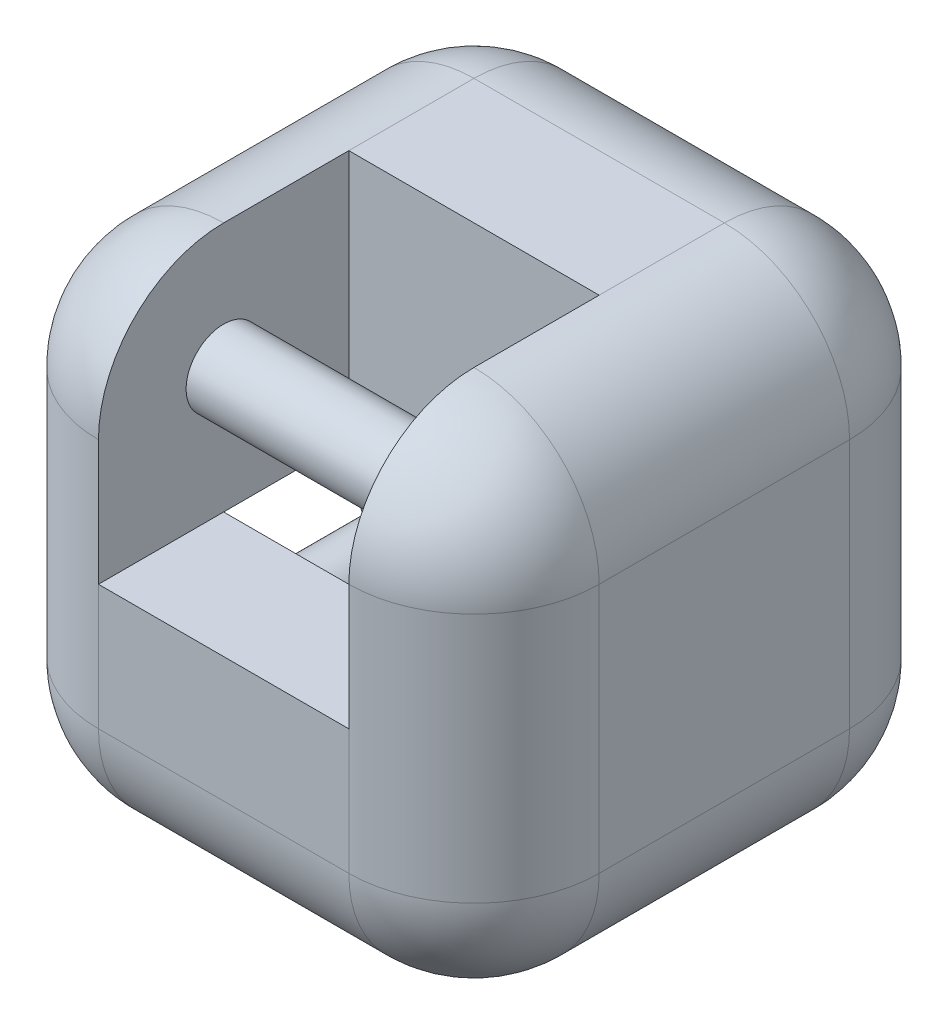
ISO-10303-21;
HEADER;
FILE_DESCRIPTION(('STEP AP214'),'2;1');
FILE_NAME('part.step','',(''),(''),'','','');
FILE_SCHEMA(('AUTOMOTIVE_DESIGN { 1 0 10303 214 1 1 1 1 }'));
ENDSEC;
DATA;
#1=APPLICATION_CONTEXT('core data for automotive mechanical design processes');
#2=APPLICATION_PROTOCOL_DEFINITION('international standard','automotive_design',2000,#1);
#3=PRODUCT_CONTEXT('',#1,'mechanical');
#4=PRODUCT('Part','Part','',(#3));
#5=PRODUCT_RELATED_PRODUCT_CATEGORY('part','',(#4));
#6=PRODUCT_DEFINITION_FORMATION('','',#4);
#7=PRODUCT_DEFINITION_CONTEXT('part definition',#1,'design');
#8=PRODUCT_DEFINITION('design','',#6,#7);
#9=PRODUCT_DEFINITION_SHAPE('','',#8);
#10=(LENGTH_UNIT() NAMED_UNIT(*) SI_UNIT(.MILLI.,.METRE.));
#11=(NAMED_UNIT(*) PLANE_ANGLE_UNIT() SI_UNIT($,.RADIAN.));
#12=(NAMED_UNIT(*) SI_UNIT($,.STERADIAN.) SOLID_ANGLE_UNIT());
#13=UNCERTAINTY_MEASURE_WITH_UNIT(LENGTH_MEASURE(1.E-05),#10,'distance_accuracy_value','');
#14=(GEOMETRIC_REPRESENTATION_CONTEXT(3) GLOBAL_UNCERTAINTY_ASSIGNED_CONTEXT((#13)) GLOBAL_UNIT_ASSIGNED_CONTEXT((#10,
#11,#12)) REPRESENTATION_CONTEXT('',''));
#15=CARTESIAN_POINT('',(0.,0.,0.));
#16=DIRECTION('',(0.,0.,1.));
#17=DIRECTION('',(1.,0.,0.));
#18=AXIS2_PLACEMENT_3D('',#15,#16,#17);
#19=CARTESIAN_POINT('',(-18.4081426876875,22.1655598813284,5.));
#20=DIRECTION('',(0.,0.,1.));
#21=DIRECTION('',(1.,0.,0.));
#22=AXIS2_PLACEMENT_3D('',#19,#20,#21);
#23=CYLINDRICAL_SURFACE('',#22,1.5);
#24=CARTESIAN_POINT('',(-18.4081426876875,22.1655598813284,5.));
#25=DIRECTION('',(0.,0.,-1.));
#26=DIRECTION('',(-1.,0.,0.));
#27=AXIS2_PLACEMENT_3D('',#24,#25,#26);
#28=CIRCLE('',#27,1.5);
#29=CARTESIAN_POINT('',(-19.9081426876875,22.1655598813284,5.));
#30=VERTEX_POINT('',#29);
#31=EDGE_CURVE('E11',#30,#30,#28,.T.);
#32=ORIENTED_EDGE('',*,*,#31,.F.);
#33=EDGE_LOOP('',(#32));
#34=FACE_BOUND('',#33,.T.);
#35=CARTESIAN_POINT('',(-18.4081426876875,22.1655598813284,15.));
#36=DIRECTION('',(0.,0.,-1.));
#37=DIRECTION('',(-1.,0.,0.));
#38=AXIS2_PLACEMENT_3D('',#35,#36,#37);
#39=CIRCLE('',#38,1.5);
#40=CARTESIAN_POINT('',(-19.9081426876875,22.1655598813284,15.));
#41=VERTEX_POINT('',#40);
#42=EDGE_CURVE('E46',#41,#41,#39,.T.);
#43=ORIENTED_EDGE('',*,*,#42,.T.);
#44=EDGE_LOOP('',(#43));
#45=FACE_BOUND('',#44,.T.);
#46=ADVANCED_FACE('F43',(#34,#45),#23,.T.);
#47=CARTESIAN_POINT('',(-18.4081426876875,22.1655598813284,5.));
#48=DIRECTION('',(0.,0.,-1.));
#49=DIRECTION('',(-1.,0.,0.));
#50=AXIS2_PLACEMENT_3D('',#47,#48,#49);
#51=PLANE('',#50);
#52=ORIENTED_EDGE('',*,*,#31,.T.);
#53=EDGE_LOOP('',(#52));
#54=FACE_BOUND('',#53,.T.);
#55=ADVANCED_FACE('F58',(#54),#51,.T.);
#56=CARTESIAN_POINT('',(-18.4081426876875,22.1655598813284,15.));
#57=DIRECTION('',(0.,0.,-1.));
#58=DIRECTION('',(-1.,0.,0.));
#59=AXIS2_PLACEMENT_3D('',#56,#57,#58);
#60=PLANE('',#59);
#61=ORIENTED_EDGE('',*,*,#42,.F.);
#62=EDGE_LOOP('',(#61));
#63=FACE_BOUND('',#62,.T.);
#64=ADVANCED_FACE('F56',(#63),#60,.F.);
#65=CLOSED_SHELL('',(#46,#55,#64));
#66=MANIFOLD_SOLID_BREP('B2',#65);
#67=CARTESIAN_POINT('',(-18.4081426876875,32.1655598813284,15.));
#68=DIRECTION('',(1.,0.,0.));
#69=DIRECTION('',(0.,0.,-1.));
#70=AXIS2_PLACEMENT_3D('',#67,#68,#69);
#71=CYLINDRICAL_SURFACE('',#70,1.5);
#72=CARTESIAN_POINT('',(-18.4081426876875,32.1655598813284,15.));
#73=DIRECTION('',(-1.,0.,0.));
#74=DIRECTION('',(0.,0.,1.));
#75=AXIS2_PLACEMENT_3D('',#72,#73,#74);
#76=CIRCLE('',#75,1.5);
#77=CARTESIAN_POINT('',(-18.4081426876875,32.1655598813284,16.5));
#78=VERTEX_POINT('',#77);
#79=EDGE_CURVE('E42',#78,#78,#76,.T.);
#80=ORIENTED_EDGE('',*,*,#79,.F.);
#81=EDGE_LOOP('',(#80));
#82=FACE_BOUND('',#81,.T.);
#83=CARTESIAN_POINT('',(-8.40814268768748,32.1655598813284,15.));
#84=DIRECTION('',(-1.,0.,0.));
#85=DIRECTION('',(0.,0.,1.));
#86=AXIS2_PLACEMENT_3D('',#83,#84,#85);
#87=CIRCLE('',#86,1.5);
#88=CARTESIAN_POINT('',(-8.40814268768748,32.1655598813284,16.5));
#89=VERTEX_POINT('',#88);
#90=EDGE_CURVE('E95',#89,#89,#87,.T.);
#91=ORIENTED_EDGE('',*,*,#90,.T.);
#92=EDGE_LOOP('',(#91));
#93=FACE_BOUND('',#92,.T.);
#94=ADVANCED_FACE('F92',(#82,#93),#71,.T.);
#95=CARTESIAN_POINT('',(-18.4081426876875,32.1655598813284,15.));
#96=DIRECTION('',(-1.,0.,0.));
#97=DIRECTION('',(0.,0.,1.));
#98=AXIS2_PLACEMENT_3D('',#95,#96,#97);
#99=PLANE('',#98);
#100=ORIENTED_EDGE('',*,*,#79,.T.);
#101=EDGE_LOOP('',(#100));
#102=FACE_BOUND('',#101,.T.);
#103=ADVANCED_FACE('F107',(#102),#99,.T.);
#104=CARTESIAN_POINT('',(-8.40814268768748,32.1655598813284,15.));
#105=DIRECTION('',(-1.,0.,0.));
#106=DIRECTION('',(0.,0.,1.));
#107=AXIS2_PLACEMENT_3D('',#104,#105,#106);
#108=PLANE('',#107);
#109=ORIENTED_EDGE('',*,*,#90,.F.);
#110=EDGE_LOOP('',(#109));
#111=FACE_BOUND('',#110,.T.);
#112=ADVANCED_FACE('F105',(#111),#108,.F.);
#113=CLOSED_SHELL('',(#94,#103,#112));
#114=MANIFOLD_SOLID_BREP('B6',#113);
#115=CARTESIAN_POINT('',(-23.4081426876875,37.1655598813284,20.));
#116=DIRECTION('',(1.,0.,0.));
#117=DIRECTION('',(0.,0.,-1.));
#118=AXIS2_PLACEMENT_3D('',#115,#116,#117);
#119=PLANE('',#118);
#120=DIRECTION('',(0.,0.,1.));
#121=VECTOR('',#120,1.);
#122=CARTESIAN_POINT('',(-23.4081426876875,27.1655598813284,5.));
#123=LINE('',#122,#121);
#124=CARTESIAN_POINT('',(-23.4081426876875,27.1655598813284,5.));
#125=VERTEX_POINT('',#124);
#126=CARTESIAN_POINT('',(-23.4081426876875,27.1655598813284,15.));
#127=VERTEX_POINT('',#126);
#128=EDGE_CURVE('E149',#125,#127,#123,.T.);
#129=ORIENTED_EDGE('',*,*,#128,.T.);
#130=DIRECTION('',(0.,-1.,0.));
#131=VECTOR('',#130,1.);
#132=CARTESIAN_POINT('',(-23.4081426876875,37.1655598813284,15.));
#133=LINE('',#132,#131);
#134=CARTESIAN_POINT('',(-23.4081426876875,32.1655598813284,15.));
#135=VERTEX_POINT('',#134);
#136=EDGE_CURVE('E325',#127,#135,#133,.F.);
#137=ORIENTED_EDGE('',*,*,#136,.T.);
#138=DIRECTION('',(0.,0.,-1.));
#139=VECTOR('',#138,1.);
#140=CARTESIAN_POINT('',(-23.4081426876875,32.1655598813284,20.));
#141=LINE('',#140,#139);
#142=CARTESIAN_POINT('',(-23.4081426876875,32.1655598813284,5.));
#143=VERTEX_POINT('',#142);
#144=EDGE_CURVE('E324',#135,#143,#141,.T.);
#145=ORIENTED_EDGE('',*,*,#144,.T.);
#146=DIRECTION('',(0.,-1.,0.));
#147=VECTOR('',#146,1.);
#148=CARTESIAN_POINT('',(-23.4081426876875,37.1655598813284,5.));
#149=LINE('',#148,#147);
#150=EDGE_CURVE('E328',#143,#125,#149,.T.);
#151=ORIENTED_EDGE('',*,*,#150,.T.);
#152=EDGE_LOOP('',(#129,#137,#145,#151));
#153=FACE_BOUND('',#152,.T.);
#154=ADVANCED_FACE('F132',(#153),#119,.F.);
#155=CARTESIAN_POINT('',(-23.4081426876875,17.1655598813284,20.));
#156=DIRECTION('',(0.,1.,0.));
#157=DIRECTION('',(0.,0.,1.));
#158=AXIS2_PLACEMENT_3D('',#155,#156,#157);
#159=PLANE('',#158);
#160=DIRECTION('',(0.,0.,1.));
#161=VECTOR('',#160,1.);
#162=CARTESIAN_POINT('',(-13.4081426876875,17.1655598813284,5.));
#163=LINE('',#162,#161);
#164=CARTESIAN_POINT('',(-13.4081426876875,17.1655598813284,5.));
#165=VERTEX_POINT('',#164);
#166=CARTESIAN_POINT('',(-13.4081426876875,17.1655598813284,15.));
#167=VERTEX_POINT('',#166);
#168=EDGE_CURVE('E288',#165,#167,#163,.T.);
#169=ORIENTED_EDGE('',*,*,#168,.F.);
#170=DIRECTION('',(1.,0.,0.));
#171=VECTOR('',#170,1.);
#172=CARTESIAN_POINT('',(-23.4081426876875,17.1655598813284,5.));
#173=LINE('',#172,#171);
#174=CARTESIAN_POINT('',(-8.40814268768748,17.1655598813284,5.));
#175=VERTEX_POINT('',#174);
#176=EDGE_CURVE('E345',#165,#175,#173,.T.);
#177=ORIENTED_EDGE('',*,*,#176,.T.);
#178=DIRECTION('',(0.,0.,-1.));
#179=VECTOR('',#178,1.);
#180=CARTESIAN_POINT('',(-8.40814268768748,17.1655598813284,20.));
#181=LINE('',#180,#179);
#182=CARTESIAN_POINT('',(-8.40814268768748,17.1655598813284,15.));
#183=VERTEX_POINT('',#182);
#184=EDGE_CURVE('E343',#175,#183,#181,.F.);
#185=ORIENTED_EDGE('',*,*,#184,.T.);
#186=DIRECTION('',(1.,0.,0.));
#187=VECTOR('',#186,1.);
#188=CARTESIAN_POINT('',(-23.4081426876875,17.1655598813284,15.));
#189=LINE('',#188,#187);
#190=EDGE_CURVE('E340',#183,#167,#189,.F.);
#191=ORIENTED_EDGE('',*,*,#190,.T.);
#192=EDGE_LOOP('',(#169,#177,#185,#191));
#193=FACE_BOUND('',#192,.T.);
#194=ADVANCED_FACE('F479',(#193),#159,.F.);
#195=CARTESIAN_POINT('',(-18.4081426876875,27.1655598813284,10.));
#196=DIRECTION('',(0.,1.,0.));
#197=DIRECTION('',(0.,0.,1.));
#198=AXIS2_PLACEMENT_3D('',#195,#196,#197);
#199=PLANE('',#198);
#200=DIRECTION('',(1.,0.,0.));
#201=VECTOR('',#200,1.);
#202=CARTESIAN_POINT('',(-18.4081426876875,27.1655598813284,10.));
#203=LINE('',#202,#201);
#204=CARTESIAN_POINT('',(-13.4081426876875,27.1655598813284,10.));
#205=VERTEX_POINT('',#204);
#206=CARTESIAN_POINT('',(-8.40814268768748,27.1655598813284,10.));
#207=VERTEX_POINT('',#206);
#208=EDGE_CURVE('E314',#205,#207,#203,.T.);
#209=ORIENTED_EDGE('',*,*,#208,.F.);
#210=DIRECTION('',(0.,0.,1.));
#211=VECTOR('',#210,1.);
#212=CARTESIAN_POINT('',(-13.4081426876875,27.1655598813284,5.));
#213=LINE('',#212,#211);
#214=CARTESIAN_POINT('',(-13.4081426876875,27.1655598813284,15.));
#215=VERTEX_POINT('',#214);
#216=EDGE_CURVE('E282',#205,#215,#213,.T.);
#217=ORIENTED_EDGE('',*,*,#216,.T.);
#218=DIRECTION('',(1.,0.,0.));
#219=VECTOR('',#218,1.);
#220=CARTESIAN_POINT('',(-13.4081426876875,27.1655598813284,15.));
#221=LINE('',#220,#219);
#222=CARTESIAN_POINT('',(-18.4081426876875,27.1655598813284,15.));
#223=VERTEX_POINT('',#222);
#224=EDGE_CURVE('E296',#223,#215,#221,.T.);
#225=ORIENTED_EDGE('',*,*,#224,.F.);
#226=DIRECTION('',(0.,0.,1.));
#227=VECTOR('',#226,1.);
#228=CARTESIAN_POINT('',(-18.4081426876875,27.1655598813284,10.));
#229=LINE('',#228,#227);
#230=CARTESIAN_POINT('',(-18.4081426876875,27.1655598813284,20.));
#231=VERTEX_POINT('',#230);
#232=EDGE_CURVE('E302',#223,#231,#229,.T.);
#233=ORIENTED_EDGE('',*,*,#232,.T.);
#234=DIRECTION('',(1.,0.,0.));
#235=VECTOR('',#234,1.);
#236=CARTESIAN_POINT('',(-18.4081426876875,27.1655598813284,20.));
#237=LINE('',#236,#235);
#238=CARTESIAN_POINT('',(-8.40814268768748,27.1655598813284,20.));
#239=VERTEX_POINT('',#238);
#240=EDGE_CURVE('E306',#231,#239,#237,.T.);
#241=ORIENTED_EDGE('',*,*,#240,.T.);
#242=DIRECTION('',(0.,0.,1.));
#243=VECTOR('',#242,1.);
#244=CARTESIAN_POINT('',(-8.40814268768748,27.1655598813284,10.));
#245=LINE('',#244,#243);
#246=EDGE_CURVE('E303',#207,#239,#245,.T.);
#247=ORIENTED_EDGE('',*,*,#246,.F.);
#248=EDGE_LOOP('',(#209,#217,#225,#233,#241,#247));
#249=FACE_BOUND('',#248,.T.);
#250=ADVANCED_FACE('F511',(#249),#199,.T.);
#251=CARTESIAN_POINT('',(-23.4081426876875,37.1655598813284,20.));
#252=DIRECTION('',(0.,-1.,0.));
#253=DIRECTION('',(0.,0.,-1.));
#254=AXIS2_PLACEMENT_3D('',#251,#252,#253);
#255=PLANE('',#254);
#256=DIRECTION('',(1.,0.,0.));
#257=VECTOR('',#256,1.);
#258=CARTESIAN_POINT('',(-18.4081426876875,37.1655598813284,10.));
#259=LINE('',#258,#257);
#260=CARTESIAN_POINT('',(-18.4081426876875,37.1655598813284,10.));
#261=VERTEX_POINT('',#260);
#262=CARTESIAN_POINT('',(-8.40814268768748,37.1655598813284,10.));
#263=VERTEX_POINT('',#262);
#264=EDGE_CURVE('E318',#261,#263,#259,.T.);
#265=ORIENTED_EDGE('',*,*,#264,.T.);
#266=DIRECTION('',(0.,0.,-1.));
#267=VECTOR('',#266,1.);
#268=CARTESIAN_POINT('',(-8.40814268768748,37.1655598813284,20.));
#269=LINE('',#268,#267);
#270=CARTESIAN_POINT('',(-8.40814268768748,37.1655598813284,5.));
#271=VERTEX_POINT('',#270);
#272=EDGE_CURVE('E356',#263,#271,#269,.T.);
#273=ORIENTED_EDGE('',*,*,#272,.T.);
#274=DIRECTION('',(-1.,0.,0.));
#275=VECTOR('',#274,1.);
#276=CARTESIAN_POINT('',(-23.4081426876875,37.1655598813284,5.));
#277=LINE('',#276,#275);
#278=CARTESIAN_POINT('',(-18.4081426876875,37.1655598813284,5.));
#279=VERTEX_POINT('',#278);
#280=EDGE_CURVE('E363',#271,#279,#277,.T.);
#281=ORIENTED_EDGE('',*,*,#280,.T.);
#282=DIRECTION('',(0.,0.,-1.));
#283=VECTOR('',#282,1.);
#284=CARTESIAN_POINT('',(-18.4081426876875,37.1655598813284,20.));
#285=LINE('',#284,#283);
#286=EDGE_CURVE('E360',#279,#261,#285,.F.);
#287=ORIENTED_EDGE('',*,*,#286,.T.);
#288=EDGE_LOOP('',(#265,#273,#281,#287));
#289=FACE_BOUND('',#288,.T.);
#290=ADVANCED_FACE('F567',(#289),#255,.F.);
#291=CARTESIAN_POINT('',(0.,0.,20.));
#292=DIRECTION('',(0.,0.,1.));
#293=DIRECTION('',(1.,0.,0.));
#294=AXIS2_PLACEMENT_3D('',#291,#292,#293);
#295=PLANE('',#294);
#296=DIRECTION('',(0.,1.,0.));
#297=VECTOR('',#296,1.);
#298=CARTESIAN_POINT('',(-8.40814268768748,37.1655598813284,20.));
#299=LINE('',#298,#297);
#300=CARTESIAN_POINT('',(-8.40814268768748,22.1655598813284,20.));
#301=VERTEX_POINT('',#300);
#302=EDGE_CURVE('E368',#301,#239,#299,.T.);
#303=ORIENTED_EDGE('',*,*,#302,.T.);
#304=ORIENTED_EDGE('',*,*,#240,.F.);
#305=DIRECTION('',(0.,-1.,0.));
#306=VECTOR('',#305,1.);
#307=CARTESIAN_POINT('',(-18.4081426876875,17.1655598813284,20.));
#308=LINE('',#307,#306);
#309=CARTESIAN_POINT('',(-18.4081426876875,22.1655598813284,20.));
#310=VERTEX_POINT('',#309);
#311=EDGE_CURVE('E141',#231,#310,#308,.T.);
#312=ORIENTED_EDGE('',*,*,#311,.T.);
#313=DIRECTION('',(1.,0.,0.));
#314=VECTOR('',#313,1.);
#315=CARTESIAN_POINT('',(-3.40814268768748,22.1655598813284,20.));
#316=LINE('',#315,#314);
#317=EDGE_CURVE('E366',#310,#301,#316,.T.);
#318=ORIENTED_EDGE('',*,*,#317,.T.);
#319=EDGE_LOOP('',(#303,#304,#312,#318));
#320=FACE_BOUND('',#319,.T.);
#321=ADVANCED_FACE('F564',(#320),#295,.T.);
#322=CARTESIAN_POINT('',(-3.40814268768748,37.1655598813284,20.));
#323=DIRECTION('',(-1.,0.,0.));
#324=DIRECTION('',(0.,0.,1.));
#325=AXIS2_PLACEMENT_3D('',#322,#323,#324);
#326=PLANE('',#325);
#327=DIRECTION('',(0.,0.,-1.));
#328=VECTOR('',#327,1.);
#329=CARTESIAN_POINT('',(-3.40814268768748,22.1655598813284,20.));
#330=LINE('',#329,#328);
#331=CARTESIAN_POINT('',(-3.40814268768748,22.1655598813284,15.));
#332=VERTEX_POINT('',#331);
#333=CARTESIAN_POINT('',(-3.40814268768748,22.1655598813284,5.));
#334=VERTEX_POINT('',#333);
#335=EDGE_CURVE('E349',#332,#334,#330,.T.);
#336=ORIENTED_EDGE('',*,*,#335,.T.);
#337=DIRECTION('',(0.,1.,0.));
#338=VECTOR('',#337,1.);
#339=CARTESIAN_POINT('',(-3.40814268768748,37.1655598813284,5.));
#340=LINE('',#339,#338);
#341=CARTESIAN_POINT('',(-3.40814268768748,32.1655598813284,5.));
#342=VERTEX_POINT('',#341);
#343=EDGE_CURVE('E353',#334,#342,#340,.T.);
#344=ORIENTED_EDGE('',*,*,#343,.T.);
#345=DIRECTION('',(0.,0.,-1.));
#346=VECTOR('',#345,1.);
#347=CARTESIAN_POINT('',(-3.40814268768748,32.1655598813284,20.));
#348=LINE('',#347,#346);
#349=CARTESIAN_POINT('',(-3.40814268768748,32.1655598813284,15.));
#350=VERTEX_POINT('',#349);
#351=EDGE_CURVE('E351',#342,#350,#348,.F.);
#352=ORIENTED_EDGE('',*,*,#351,.T.);
#353=DIRECTION('',(0.,1.,0.));
#354=VECTOR('',#353,1.);
#355=CARTESIAN_POINT('',(-3.40814268768748,17.1655598813284,15.));
#356=LINE('',#355,#354);
#357=EDGE_CURVE('E347',#350,#332,#356,.F.);
#358=ORIENTED_EDGE('',*,*,#357,.T.);
#359=EDGE_LOOP('',(#336,#344,#352,#358));
#360=FACE_BOUND('',#359,.T.);
#361=ADVANCED_FACE('F494',(#360),#326,.F.);
#362=CARTESIAN_POINT('',(0.,0.,0.));
#363=DIRECTION('',(0.,0.,1.));
#364=DIRECTION('',(1.,0.,0.));
#365=AXIS2_PLACEMENT_3D('',#362,#363,#364);
#366=PLANE('',#365);
#367=DIRECTION('',(1.,0.,0.));
#368=VECTOR('',#367,1.);
#369=CARTESIAN_POINT('',(0.,22.1655598813284,0.));
#370=LINE('',#369,#368);
#371=CARTESIAN_POINT('',(-8.40814268768748,22.1655598813284,0.));
#372=VERTEX_POINT('',#371);
#373=CARTESIAN_POINT('',(-18.4081426876875,22.1655598813284,0.));
#374=VERTEX_POINT('',#373);
#375=EDGE_CURVE('E335',#372,#374,#370,.F.);
#376=ORIENTED_EDGE('',*,*,#375,.T.);
#377=DIRECTION('',(0.,-1.,0.));
#378=VECTOR('',#377,1.);
#379=CARTESIAN_POINT('',(-18.4081426876875,0.,0.));
#380=LINE('',#379,#378);
#381=CARTESIAN_POINT('',(-18.4081426876875,32.1655598813284,0.));
#382=VERTEX_POINT('',#381);
#383=EDGE_CURVE('E337',#374,#382,#380,.F.);
#384=ORIENTED_EDGE('',*,*,#383,.T.);
#385=DIRECTION('',(-1.,0.,0.));
#386=VECTOR('',#385,1.);
#387=CARTESIAN_POINT('',(0.,32.1655598813284,0.));
#388=LINE('',#387,#386);
#389=CARTESIAN_POINT('',(-8.40814268768748,32.1655598813284,0.));
#390=VERTEX_POINT('',#389);
#391=EDGE_CURVE('E331',#382,#390,#388,.F.);
#392=ORIENTED_EDGE('',*,*,#391,.T.);
#393=DIRECTION('',(0.,1.,0.));
#394=VECTOR('',#393,1.);
#395=CARTESIAN_POINT('',(-8.40814268768748,0.,0.));
#396=LINE('',#395,#394);
#397=EDGE_CURVE('E333',#390,#372,#396,.F.);
#398=ORIENTED_EDGE('',*,*,#397,.T.);
#399=EDGE_LOOP('',(#376,#384,#392,#398));
#400=FACE_BOUND('',#399,.T.);
#401=ADVANCED_FACE('F577',(#400),#366,.F.);
#402=CARTESIAN_POINT('',(-8.40814268768748,0.,15.));
#403=DIRECTION('',(0.,-1.,0.));
#404=DIRECTION('',(0.,0.,-1.));
#405=AXIS2_PLACEMENT_3D('',#402,#403,#404);
#406=CYLINDRICAL_SURFACE('',#405,5.);
#407=CARTESIAN_POINT('',(-8.40814268768748,32.1655598813284,15.));
#408=DIRECTION('',(0.,1.,0.));
#409=DIRECTION('',(0.,0.,1.));
#410=AXIS2_PLACEMENT_3D('',#407,#408,#409);
#411=CIRCLE('',#410,5.);
#412=CARTESIAN_POINT('',(-8.40814268768748,32.1655598813284,20.));
#413=VERTEX_POINT('',#412);
#414=EDGE_CURVE('E136',#413,#350,#411,.T.);
#415=ORIENTED_EDGE('',*,*,#414,.F.);
#416=DIRECTION('',(0.,1.,0.));
#417=VECTOR('',#416,1.);
#418=CARTESIAN_POINT('',(-8.40814268768748,27.1655598813284,20.));
#419=LINE('',#418,#417);
#420=EDGE_CURVE('E300',#239,#413,#419,.T.);
#421=ORIENTED_EDGE('',*,*,#420,.F.);
#422=ORIENTED_EDGE('',*,*,#302,.F.);
#423=CARTESIAN_POINT('',(-8.40814268768748,22.1655598813284,15.));
#424=DIRECTION('',(0.,-1.,0.));
#425=DIRECTION('',(0.,0.,-1.));
#426=AXIS2_PLACEMENT_3D('',#423,#424,#425);
#427=CIRCLE('',#426,5.);
#428=EDGE_CURVE('E430',#332,#301,#427,.T.);
#429=ORIENTED_EDGE('',*,*,#428,.F.);
#430=ORIENTED_EDGE('',*,*,#357,.F.);
#431=EDGE_LOOP('',(#415,#421,#422,#429,#430));
#432=FACE_BOUND('',#431,.T.);
#433=ADVANCED_FACE('F134',(#432),#406,.T.);
#434=CARTESIAN_POINT('',(-8.40814268768748,32.1655598813284,15.));
#435=DIRECTION('',(0.,0.,1.));
#436=DIRECTION('',(1.,0.,0.));
#437=AXIS2_PLACEMENT_3D('',#434,#435,#436);
#438=SPHERICAL_SURFACE('',#437,5.);
#439=CARTESIAN_POINT('',(-8.40814268768748,32.1655598813284,15.));
#440=DIRECTION('',(1.,0.,0.));
#441=DIRECTION('',(0.,0.,-1.));
#442=AXIS2_PLACEMENT_3D('',#439,#440,#441);
#443=CIRCLE('',#442,5.);
#444=CARTESIAN_POINT('',(-8.40814268768748,37.1655598813284,15.));
#445=VERTEX_POINT('',#444);
#446=EDGE_CURVE('E426',#413,#445,#443,.F.);
#447=ORIENTED_EDGE('',*,*,#446,.F.);
#448=ORIENTED_EDGE('',*,*,#414,.T.);
#449=CARTESIAN_POINT('',(-8.40814268768748,32.1655598813284,15.));
#450=DIRECTION('',(0.,0.,1.));
#451=DIRECTION('',(1.,0.,0.));
#452=AXIS2_PLACEMENT_3D('',#449,#450,#451);
#453=CIRCLE('',#452,5.);
#454=EDGE_CURVE('E428',#445,#350,#453,.F.);
#455=ORIENTED_EDGE('',*,*,#454,.F.);
#456=EDGE_LOOP('',(#447,#448,#455));
#457=FACE_BOUND('',#456,.T.);
#458=ADVANCED_FACE('F559',(#457),#438,.T.);
#459=CARTESIAN_POINT('',(-8.40814268768748,22.1655598813284,15.));
#460=DIRECTION('',(0.,0.,1.));
#461=DIRECTION('',(1.,0.,0.));
#462=AXIS2_PLACEMENT_3D('',#459,#460,#461);
#463=SPHERICAL_SURFACE('',#462,5.);
#464=CARTESIAN_POINT('',(-8.40814268768748,22.1655598813284,15.));
#465=DIRECTION('',(0.,0.,1.));
#466=DIRECTION('',(1.,0.,0.));
#467=AXIS2_PLACEMENT_3D('',#464,#465,#466);
#468=CIRCLE('',#467,5.);
#469=EDGE_CURVE('E420',#332,#183,#468,.F.);
#470=ORIENTED_EDGE('',*,*,#469,.F.);
#471=ORIENTED_EDGE('',*,*,#428,.T.);
#472=CARTESIAN_POINT('',(-8.40814268768748,22.1655598813284,15.));
#473=DIRECTION('',(1.,0.,0.));
#474=DIRECTION('',(0.,0.,-1.));
#475=AXIS2_PLACEMENT_3D('',#472,#473,#474);
#476=CIRCLE('',#475,5.);
#477=EDGE_CURVE('E423',#183,#301,#476,.F.);
#478=ORIENTED_EDGE('',*,*,#477,.F.);
#479=EDGE_LOOP('',(#470,#471,#478));
#480=FACE_BOUND('',#479,.T.);
#481=ADVANCED_FACE('F499',(#480),#463,.T.);
#482=CARTESIAN_POINT('',(-8.40814268768748,32.1655598813284,20.));
#483=DIRECTION('',(0.,0.,-1.));
#484=DIRECTION('',(-1.,0.,0.));
#485=AXIS2_PLACEMENT_3D('',#482,#483,#484);
#486=CYLINDRICAL_SURFACE('',#485,5.);
#487=ORIENTED_EDGE('',*,*,#454,.T.);
#488=ORIENTED_EDGE('',*,*,#351,.F.);
#489=CARTESIAN_POINT('',(-8.40814268768748,32.1655598813284,5.));
#490=DIRECTION('',(0.,0.,-1.));
#491=DIRECTION('',(-1.,0.,0.));
#492=AXIS2_PLACEMENT_3D('',#489,#490,#491);
#493=CIRCLE('',#492,5.);
#494=EDGE_CURVE('E415',#271,#342,#493,.T.);
#495=ORIENTED_EDGE('',*,*,#494,.F.);
#496=ORIENTED_EDGE('',*,*,#272,.F.);
#497=EDGE_CURVE('E357',#445,#263,#269,.T.);
#498=ORIENTED_EDGE('',*,*,#497,.F.);
#499=EDGE_LOOP('',(#487,#488,#495,#496,#498));
#500=FACE_BOUND('',#499,.T.);
#501=ADVANCED_FACE('F557',(#500),#486,.T.);
#502=CARTESIAN_POINT('',(-18.4081426876875,0.,15.));
#503=DIRECTION('',(0.,1.,0.));
#504=DIRECTION('',(0.,0.,1.));
#505=AXIS2_PLACEMENT_3D('',#502,#503,#504);
#506=CYLINDRICAL_SURFACE('',#505,5.);
#507=CARTESIAN_POINT('',(-18.4081426876875,22.1655598813284,15.));
#508=DIRECTION('',(0.,-1.,0.));
#509=DIRECTION('',(0.,0.,-1.));
#510=AXIS2_PLACEMENT_3D('',#507,#508,#509);
#511=CIRCLE('',#510,5.);
#512=CARTESIAN_POINT('',(-23.4081426876875,22.1655598813284,15.));
#513=VERTEX_POINT('',#512);
#514=EDGE_CURVE('E406',#310,#513,#511,.T.);
#515=ORIENTED_EDGE('',*,*,#514,.F.);
#516=ORIENTED_EDGE('',*,*,#311,.F.);
#517=CARTESIAN_POINT('',(-18.4081426876875,32.1655598813284,20.));
#518=VERTEX_POINT('',#517);
#519=EDGE_CURVE('E90',#518,#231,#308,.T.);
#520=ORIENTED_EDGE('',*,*,#519,.F.);
#521=CARTESIAN_POINT('',(-18.4081426876875,32.1655598813284,15.));
#522=DIRECTION('',(0.,1.,0.));
#523=DIRECTION('',(0.,0.,1.));
#524=AXIS2_PLACEMENT_3D('',#521,#522,#523);
#525=CIRCLE('',#524,5.);
#526=EDGE_CURVE('E409',#135,#518,#525,.T.);
#527=ORIENTED_EDGE('',*,*,#526,.F.);
#528=ORIENTED_EDGE('',*,*,#136,.F.);
#529=EDGE_CURVE('E322',#513,#127,#133,.F.);
#530=ORIENTED_EDGE('',*,*,#529,.F.);
#531=EDGE_LOOP('',(#515,#516,#520,#527,#528,#530));
#532=FACE_BOUND('',#531,.T.);
#533=ADVANCED_FACE('F451',(#532),#506,.T.);
#534=CARTESIAN_POINT('',(0.,22.1655598813284,15.));
#535=DIRECTION('',(-1.,0.,0.));
#536=DIRECTION('',(0.,0.,1.));
#537=AXIS2_PLACEMENT_3D('',#534,#535,#536);
#538=CYLINDRICAL_SURFACE('',#537,5.);
#539=ORIENTED_EDGE('',*,*,#477,.T.);
#540=ORIENTED_EDGE('',*,*,#317,.F.);
#541=CARTESIAN_POINT('',(-18.4081426876875,22.1655598813284,15.));
#542=DIRECTION('',(-1.,0.,0.));
#543=DIRECTION('',(0.,0.,1.));
#544=AXIS2_PLACEMENT_3D('',#541,#542,#543);
#545=CIRCLE('',#544,5.);
#546=CARTESIAN_POINT('',(-18.4081426876875,17.1655598813284,15.));
#547=VERTEX_POINT('',#546);
#548=EDGE_CURVE('E403',#547,#310,#545,.T.);
#549=ORIENTED_EDGE('',*,*,#548,.F.);
#550=DIRECTION('',(-1.,0.,0.));
#551=VECTOR('',#550,1.);
#552=CARTESIAN_POINT('',(-13.4081426876875,17.1655598813284,15.));
#553=LINE('',#552,#551);
#554=EDGE_CURVE('E274',#167,#547,#553,.T.);
#555=ORIENTED_EDGE('',*,*,#554,.F.);
#556=ORIENTED_EDGE('',*,*,#190,.F.);
#557=EDGE_LOOP('',(#539,#540,#549,#555,#556));
#558=FACE_BOUND('',#557,.T.);
#559=ADVANCED_FACE('F504',(#558),#538,.T.);
#560=CARTESIAN_POINT('',(-8.40814268768748,22.1655598813284,20.));
#561=DIRECTION('',(0.,0.,-1.));
#562=DIRECTION('',(-1.,0.,0.));
#563=AXIS2_PLACEMENT_3D('',#560,#561,#562);
#564=CYLINDRICAL_SURFACE('',#563,5.);
#565=ORIENTED_EDGE('',*,*,#469,.T.);
#566=ORIENTED_EDGE('',*,*,#184,.F.);
#567=CARTESIAN_POINT('',(-8.40814268768748,22.1655598813284,5.));
#568=DIRECTION('',(0.,0.,-1.));
#569=DIRECTION('',(-1.,0.,0.));
#570=AXIS2_PLACEMENT_3D('',#567,#568,#569);
#571=CIRCLE('',#570,5.);
#572=EDGE_CURVE('E400',#334,#175,#571,.T.);
#573=ORIENTED_EDGE('',*,*,#572,.F.);
#574=ORIENTED_EDGE('',*,*,#335,.F.);
#575=EDGE_LOOP('',(#565,#566,#573,#574));
#576=FACE_BOUND('',#575,.T.);
#577=ADVANCED_FACE('F482',(#576),#564,.T.);
#578=CARTESIAN_POINT('',(-8.40814268768748,37.1655598813284,5.));
#579=DIRECTION('',(0.,1.,0.));
#580=DIRECTION('',(0.,0.,1.));
#581=AXIS2_PLACEMENT_3D('',#578,#579,#580);
#582=CYLINDRICAL_SURFACE('',#581,5.);
#583=CARTESIAN_POINT('',(-8.40814268768748,32.1655598813284,5.));
#584=DIRECTION('',(0.,1.,0.));
#585=DIRECTION('',(0.,0.,1.));
#586=AXIS2_PLACEMENT_3D('',#583,#584,#585);
#587=CIRCLE('',#586,5.);
#588=EDGE_CURVE('E417',#342,#390,#587,.T.);
#589=ORIENTED_EDGE('',*,*,#588,.F.);
#590=ORIENTED_EDGE('',*,*,#343,.F.);
#591=CARTESIAN_POINT('',(-8.40814268768748,22.1655598813284,5.));
#592=DIRECTION('',(0.,-1.,0.));
#593=DIRECTION('',(0.,0.,-1.));
#594=AXIS2_PLACEMENT_3D('',#591,#592,#593);
#595=CIRCLE('',#594,5.);
#596=EDGE_CURVE('E397',#372,#334,#595,.T.);
#597=ORIENTED_EDGE('',*,*,#596,.F.);
#598=ORIENTED_EDGE('',*,*,#397,.F.);
#599=EDGE_LOOP('',(#589,#590,#597,#598));
#600=FACE_BOUND('',#599,.T.);
#601=ADVANCED_FACE('F491',(#600),#582,.T.);
#602=CARTESIAN_POINT('',(-8.40814268768748,32.1655598813284,5.));
#603=DIRECTION('',(0.,0.,1.));
#604=DIRECTION('',(1.,0.,0.));
#605=AXIS2_PLACEMENT_3D('',#602,#603,#604);
#606=SPHERICAL_SURFACE('',#605,5.);
#607=ORIENTED_EDGE('',*,*,#494,.T.);
#608=ORIENTED_EDGE('',*,*,#588,.T.);
#609=CARTESIAN_POINT('',(-8.40814268768748,32.1655598813284,5.));
#610=DIRECTION('',(1.,0.,0.));
#611=DIRECTION('',(0.,0.,-1.));
#612=AXIS2_PLACEMENT_3D('',#609,#610,#611);
#613=CIRCLE('',#612,5.);
#614=EDGE_CURVE('E394',#271,#390,#613,.F.);
#615=ORIENTED_EDGE('',*,*,#614,.F.);
#616=EDGE_LOOP('',(#607,#608,#615));
#617=FACE_BOUND('',#616,.T.);
#618=ADVANCED_FACE('F527',(#617),#606,.T.);
#619=CARTESIAN_POINT('',(-18.4081426876875,32.1655598813284,15.));
#620=DIRECTION('',(0.,0.,1.));
#621=DIRECTION('',(1.,0.,0.));
#622=AXIS2_PLACEMENT_3D('',#619,#620,#621);
#623=SPHERICAL_SURFACE('',#622,5.);
#624=ORIENTED_EDGE('',*,*,#526,.T.);
#625=CARTESIAN_POINT('',(-18.4081426876875,32.1655598813284,15.));
#626=DIRECTION('',(-1.,0.,0.));
#627=DIRECTION('',(0.,0.,1.));
#628=AXIS2_PLACEMENT_3D('',#625,#626,#627);
#629=CIRCLE('',#628,5.);
#630=CARTESIAN_POINT('',(-18.4081426876875,37.1655598813284,15.));
#631=VERTEX_POINT('',#630);
#632=EDGE_CURVE('E412',#518,#631,#629,.T.);
#633=ORIENTED_EDGE('',*,*,#632,.T.);
#634=CARTESIAN_POINT('',(-18.4081426876875,32.1655598813284,15.));
#635=DIRECTION('',(0.,0.,1.));
#636=DIRECTION('',(1.,0.,0.));
#637=AXIS2_PLACEMENT_3D('',#634,#635,#636);
#638=CIRCLE('',#637,5.);
#639=EDGE_CURVE('E391',#135,#631,#638,.F.);
#640=ORIENTED_EDGE('',*,*,#639,.F.);
#641=EDGE_LOOP('',(#624,#633,#640));
#642=FACE_BOUND('',#641,.T.);
#643=ADVANCED_FACE('F454',(#642),#623,.T.);
#644=CARTESIAN_POINT('',(-18.4081426876875,22.1655598813284,15.));
#645=DIRECTION('',(0.,0.,1.));
#646=DIRECTION('',(1.,0.,0.));
#647=AXIS2_PLACEMENT_3D('',#644,#645,#646);
#648=SPHERICAL_SURFACE('',#647,5.);
#649=ORIENTED_EDGE('',*,*,#548,.T.);
#650=ORIENTED_EDGE('',*,*,#514,.T.);
#651=CARTESIAN_POINT('',(-18.4081426876875,22.1655598813284,15.));
#652=DIRECTION('',(0.,0.,1.));
#653=DIRECTION('',(1.,0.,0.));
#654=AXIS2_PLACEMENT_3D('',#651,#652,#653);
#655=CIRCLE('',#654,5.);
#656=EDGE_CURVE('E389',#547,#513,#655,.F.);
#657=ORIENTED_EDGE('',*,*,#656,.F.);
#658=EDGE_LOOP('',(#649,#650,#657));
#659=FACE_BOUND('',#658,.T.);
#660=ADVANCED_FACE('F518',(#659),#648,.T.);
#661=CARTESIAN_POINT('',(-8.40814268768748,22.1655598813284,5.));
#662=DIRECTION('',(0.,0.,1.));
#663=DIRECTION('',(1.,0.,0.));
#664=AXIS2_PLACEMENT_3D('',#661,#662,#663);
#665=SPHERICAL_SURFACE('',#664,5.);
#666=ORIENTED_EDGE('',*,*,#596,.T.);
#667=ORIENTED_EDGE('',*,*,#572,.T.);
#668=CARTESIAN_POINT('',(-8.40814268768748,22.1655598813284,5.));
#669=DIRECTION('',(1.,0.,0.));
#670=DIRECTION('',(0.,0.,-1.));
#671=AXIS2_PLACEMENT_3D('',#668,#669,#670);
#672=CIRCLE('',#671,5.);
#673=EDGE_CURVE('E386',#372,#175,#672,.F.);
#674=ORIENTED_EDGE('',*,*,#673,.F.);
#675=EDGE_LOOP('',(#666,#667,#674));
#676=FACE_BOUND('',#675,.T.);
#677=ADVANCED_FACE('F485',(#676),#665,.T.);
#678=CARTESIAN_POINT('',(-23.4081426876875,32.1655598813284,5.));
#679=DIRECTION('',(-1.,0.,0.));
#680=DIRECTION('',(0.,0.,1.));
#681=AXIS2_PLACEMENT_3D('',#678,#679,#680);
#682=CYLINDRICAL_SURFACE('',#681,5.);
#683=ORIENTED_EDGE('',*,*,#614,.T.);
#684=ORIENTED_EDGE('',*,*,#391,.F.);
#685=CARTESIAN_POINT('',(-18.4081426876875,32.1655598813284,5.));
#686=DIRECTION('',(-1.,0.,0.));
#687=DIRECTION('',(0.,0.,1.));
#688=AXIS2_PLACEMENT_3D('',#685,#686,#687);
#689=CIRCLE('',#688,5.);
#690=EDGE_CURVE('E383',#279,#382,#689,.T.);
#691=ORIENTED_EDGE('',*,*,#690,.F.);
#692=ORIENTED_EDGE('',*,*,#280,.F.);
#693=EDGE_LOOP('',(#683,#684,#691,#692));
#694=FACE_BOUND('',#693,.T.);
#695=ADVANCED_FACE('F525',(#694),#682,.T.);
#696=CARTESIAN_POINT('',(-18.4081426876875,32.1655598813284,20.));
#697=DIRECTION('',(0.,0.,-1.));
#698=DIRECTION('',(-1.,0.,0.));
#699=AXIS2_PLACEMENT_3D('',#696,#697,#698);
#700=CYLINDRICAL_SURFACE('',#699,5.);
#701=ORIENTED_EDGE('',*,*,#639,.T.);
#702=EDGE_CURVE('E359',#261,#631,#285,.F.);
#703=ORIENTED_EDGE('',*,*,#702,.F.);
#704=ORIENTED_EDGE('',*,*,#286,.F.);
#705=CARTESIAN_POINT('',(-18.4081426876875,32.1655598813284,5.));
#706=DIRECTION('',(0.,0.,-1.));
#707=DIRECTION('',(-1.,0.,0.));
#708=AXIS2_PLACEMENT_3D('',#705,#706,#707);
#709=CIRCLE('',#708,5.);
#710=EDGE_CURVE('E381',#143,#279,#709,.T.);
#711=ORIENTED_EDGE('',*,*,#710,.F.);
#712=ORIENTED_EDGE('',*,*,#144,.F.);
#713=EDGE_LOOP('',(#701,#703,#704,#711,#712));
#714=FACE_BOUND('',#713,.T.);
#715=ADVANCED_FACE('F457',(#714),#700,.T.);
#716=CARTESIAN_POINT('',(-23.4081426876875,22.1655598813284,5.));
#717=DIRECTION('',(1.,0.,0.));
#718=DIRECTION('',(0.,0.,-1.));
#719=AXIS2_PLACEMENT_3D('',#716,#717,#718);
#720=CYLINDRICAL_SURFACE('',#719,5.);
#721=ORIENTED_EDGE('',*,*,#673,.T.);
#722=ORIENTED_EDGE('',*,*,#176,.F.);
#723=CARTESIAN_POINT('',(-18.4081426876875,17.1655598813284,5.));
#724=VERTEX_POINT('',#723);
#725=EDGE_CURVE('E286',#724,#165,#173,.T.);
#726=ORIENTED_EDGE('',*,*,#725,.F.);
#727=CARTESIAN_POINT('',(-18.4081426876875,22.1655598813284,5.));
#728=DIRECTION('',(-1.,0.,0.));
#729=DIRECTION('',(0.,0.,1.));
#730=AXIS2_PLACEMENT_3D('',#727,#728,#729);
#731=CIRCLE('',#730,5.);
#732=EDGE_CURVE('E375',#374,#724,#731,.T.);
#733=ORIENTED_EDGE('',*,*,#732,.F.);
#734=ORIENTED_EDGE('',*,*,#375,.F.);
#735=EDGE_LOOP('',(#721,#722,#726,#733,#734));
#736=FACE_BOUND('',#735,.T.);
#737=ADVANCED_FACE('F475',(#736),#720,.T.);
#738=CARTESIAN_POINT('',(-18.4081426876875,32.1655598813284,5.));
#739=DIRECTION('',(0.,0.,1.));
#740=DIRECTION('',(1.,0.,0.));
#741=AXIS2_PLACEMENT_3D('',#738,#739,#740);
#742=SPHERICAL_SURFACE('',#741,5.);
#743=ORIENTED_EDGE('',*,*,#710,.T.);
#744=ORIENTED_EDGE('',*,*,#690,.T.);
#745=CARTESIAN_POINT('',(-18.4081426876875,32.1655598813284,5.));
#746=DIRECTION('',(0.,1.,0.));
#747=DIRECTION('',(0.,0.,1.));
#748=AXIS2_PLACEMENT_3D('',#745,#746,#747);
#749=CIRCLE('',#748,5.);
#750=EDGE_CURVE('E373',#143,#382,#749,.F.);
#751=ORIENTED_EDGE('',*,*,#750,.F.);
#752=EDGE_LOOP('',(#743,#744,#751));
#753=FACE_BOUND('',#752,.T.);
#754=ADVANCED_FACE('F463',(#753),#742,.T.);
#755=CARTESIAN_POINT('',(-18.4081426876875,22.1655598813284,5.));
#756=DIRECTION('',(0.,0.,1.));
#757=DIRECTION('',(1.,0.,0.));
#758=AXIS2_PLACEMENT_3D('',#755,#756,#757);
#759=SPHERICAL_SURFACE('',#758,5.);
#760=ORIENTED_EDGE('',*,*,#732,.T.);
#761=CARTESIAN_POINT('',(-18.4081426876875,22.1655598813284,5.));
#762=DIRECTION('',(0.,0.,-1.));
#763=DIRECTION('',(-1.,0.,0.));
#764=AXIS2_PLACEMENT_3D('',#761,#762,#763);
#765=CIRCLE('',#764,5.);
#766=CARTESIAN_POINT('',(-23.4081426876875,22.1655598813284,5.));
#767=VERTEX_POINT('',#766);
#768=EDGE_CURVE('E378',#724,#767,#765,.T.);
#769=ORIENTED_EDGE('',*,*,#768,.T.);
#770=CARTESIAN_POINT('',(-18.4081426876875,22.1655598813284,5.));
#771=DIRECTION('',(0.,-1.,0.));
#772=DIRECTION('',(0.,0.,-1.));
#773=AXIS2_PLACEMENT_3D('',#770,#771,#772);
#774=CIRCLE('',#773,5.);
#775=EDGE_CURVE('E321',#374,#767,#774,.F.);
#776=ORIENTED_EDGE('',*,*,#775,.F.);
#777=EDGE_LOOP('',(#760,#769,#776));
#778=FACE_BOUND('',#777,.T.);
#779=ADVANCED_FACE('F471',(#778),#759,.T.);
#780=CARTESIAN_POINT('',(-18.4081426876875,37.1655598813284,5.));
#781=DIRECTION('',(0.,-1.,0.));
#782=DIRECTION('',(0.,0.,-1.));
#783=AXIS2_PLACEMENT_3D('',#780,#781,#782);
#784=CYLINDRICAL_SURFACE('',#783,5.);
#785=ORIENTED_EDGE('',*,*,#750,.T.);
#786=ORIENTED_EDGE('',*,*,#383,.F.);
#787=ORIENTED_EDGE('',*,*,#775,.T.);
#788=EDGE_CURVE('E327',#125,#767,#149,.T.);
#789=ORIENTED_EDGE('',*,*,#788,.F.);
#790=ORIENTED_EDGE('',*,*,#150,.F.);
#791=EDGE_LOOP('',(#785,#786,#787,#789,#790));
#792=FACE_BOUND('',#791,.T.);
#793=ADVANCED_FACE('F467',(#792),#784,.T.);
#794=CARTESIAN_POINT('',(-18.4081426876875,27.1655598813284,10.));
#795=DIRECTION('',(0.,0.,1.));
#796=DIRECTION('',(1.,0.,0.));
#797=AXIS2_PLACEMENT_3D('',#794,#795,#796);
#798=PLANE('',#797);
#799=DIRECTION('',(0.,-1.,0.));
#800=VECTOR('',#799,1.);
#801=CARTESIAN_POINT('',(-8.40814268768748,27.1655598813284,10.));
#802=LINE('',#801,#800);
#803=EDGE_CURVE('E308',#263,#207,#802,.T.);
#804=ORIENTED_EDGE('',*,*,#803,.F.);
#805=ORIENTED_EDGE('',*,*,#264,.F.);
#806=DIRECTION('',(0.,-1.,0.));
#807=VECTOR('',#806,1.);
#808=CARTESIAN_POINT('',(-18.4081426876875,27.1655598813284,10.));
#809=LINE('',#808,#807);
#810=CARTESIAN_POINT('',(-18.4081426876875,27.1655598813284,10.));
#811=VERTEX_POINT('',#810);
#812=EDGE_CURVE('E157',#261,#811,#809,.T.);
#813=ORIENTED_EDGE('',*,*,#812,.T.);
#814=EDGE_CURVE('E315',#811,#205,#203,.T.);
#815=ORIENTED_EDGE('',*,*,#814,.T.);
#816=ORIENTED_EDGE('',*,*,#208,.T.);
#817=EDGE_LOOP('',(#804,#805,#813,#815,#816));
#818=FACE_BOUND('',#817,.T.);
#819=ADVANCED_FACE('F516',(#818),#798,.T.);
#820=CARTESIAN_POINT('',(-18.4081426876875,0.,0.));
#821=DIRECTION('',(1.,0.,0.));
#822=DIRECTION('',(0.,0.,-1.));
#823=AXIS2_PLACEMENT_3D('',#820,#821,#822);
#824=PLANE('',#823);
#825=ORIENTED_EDGE('',*,*,#519,.T.);
#826=ORIENTED_EDGE('',*,*,#232,.F.);
#827=EDGE_CURVE('E304',#811,#223,#229,.T.);
#828=ORIENTED_EDGE('',*,*,#827,.F.);
#829=ORIENTED_EDGE('',*,*,#812,.F.);
#830=ORIENTED_EDGE('',*,*,#702,.T.);
#831=ORIENTED_EDGE('',*,*,#632,.F.);
#832=EDGE_LOOP('',(#825,#826,#828,#829,#830,#831));
#833=FACE_BOUND('',#832,.T.);
#834=ADVANCED_FACE('F565',(#833),#824,.T.);
#835=CARTESIAN_POINT('',(-8.40814268768748,0.,0.));
#836=DIRECTION('',(1.,0.,0.));
#837=DIRECTION('',(0.,0.,-1.));
#838=AXIS2_PLACEMENT_3D('',#835,#836,#837);
#839=PLANE('',#838);
#840=ORIENTED_EDGE('',*,*,#446,.T.);
#841=ORIENTED_EDGE('',*,*,#497,.T.);
#842=ORIENTED_EDGE('',*,*,#803,.T.);
#843=ORIENTED_EDGE('',*,*,#246,.T.);
#844=ORIENTED_EDGE('',*,*,#420,.T.);
#845=EDGE_LOOP('',(#840,#841,#842,#843,#844));
#846=FACE_BOUND('',#845,.T.);
#847=ADVANCED_FACE('F561',(#846),#839,.F.);
#848=CARTESIAN_POINT('',(-13.4081426876875,27.1655598813284,5.));
#849=DIRECTION('',(0.,-1.,0.));
#850=DIRECTION('',(0.,0.,-1.));
#851=AXIS2_PLACEMENT_3D('',#848,#849,#850);
#852=PLANE('',#851);
#853=ORIENTED_EDGE('',*,*,#827,.T.);
#854=EDGE_CURVE('E292',#127,#223,#221,.T.);
#855=ORIENTED_EDGE('',*,*,#854,.F.);
#856=ORIENTED_EDGE('',*,*,#128,.F.);
#857=DIRECTION('',(1.,0.,0.));
#858=VECTOR('',#857,1.);
#859=CARTESIAN_POINT('',(-13.4081426876875,27.1655598813284,5.));
#860=LINE('',#859,#858);
#861=CARTESIAN_POINT('',(-13.4081426876875,27.1655598813284,5.));
#862=VERTEX_POINT('',#861);
#863=EDGE_CURVE('E265',#125,#862,#860,.T.);
#864=ORIENTED_EDGE('',*,*,#863,.T.);
#865=EDGE_CURVE('E268',#862,#205,#213,.T.);
#866=ORIENTED_EDGE('',*,*,#865,.T.);
#867=ORIENTED_EDGE('',*,*,#814,.F.);
#868=EDGE_LOOP('',(#853,#855,#856,#864,#866,#867));
#869=FACE_BOUND('',#868,.T.);
#870=ADVANCED_FACE('F267',(#869),#852,.T.);
#871=CARTESIAN_POINT('',(-13.4081426876875,27.1655598813284,5.));
#872=DIRECTION('',(-1.,0.,0.));
#873=DIRECTION('',(0.,0.,1.));
#874=AXIS2_PLACEMENT_3D('',#871,#872,#873);
#875=PLANE('',#874);
#876=DIRECTION('',(0.,-1.,0.));
#877=VECTOR('',#876,1.);
#878=CARTESIAN_POINT('',(-13.4081426876875,27.1655598813284,15.));
#879=LINE('',#878,#877);
#880=EDGE_CURVE('E295',#215,#167,#879,.T.);
#881=ORIENTED_EDGE('',*,*,#880,.F.);
#882=ORIENTED_EDGE('',*,*,#216,.F.);
#883=ORIENTED_EDGE('',*,*,#865,.F.);
#884=DIRECTION('',(0.,-1.,0.));
#885=VECTOR('',#884,1.);
#886=CARTESIAN_POINT('',(-13.4081426876875,27.1655598813284,5.));
#887=LINE('',#886,#885);
#888=EDGE_CURVE('E273',#862,#165,#887,.T.);
#889=ORIENTED_EDGE('',*,*,#888,.T.);
#890=ORIENTED_EDGE('',*,*,#168,.T.);
#891=EDGE_LOOP('',(#881,#882,#883,#889,#890));
#892=FACE_BOUND('',#891,.T.);
#893=ADVANCED_FACE('F278',(#892),#875,.T.);
#894=CARTESIAN_POINT('',(0.,0.,5.));
#895=DIRECTION('',(0.,0.,-1.));
#896=DIRECTION('',(-1.,0.,0.));
#897=AXIS2_PLACEMENT_3D('',#894,#895,#896);
#898=PLANE('',#897);
#899=ORIENTED_EDGE('',*,*,#768,.F.);
#900=ORIENTED_EDGE('',*,*,#725,.T.);
#901=ORIENTED_EDGE('',*,*,#888,.F.);
#902=ORIENTED_EDGE('',*,*,#863,.F.);
#903=ORIENTED_EDGE('',*,*,#788,.T.);
#904=EDGE_LOOP('',(#899,#900,#901,#902,#903));
#905=FACE_BOUND('',#904,.T.);
#906=ADVANCED_FACE('F284',(#905),#898,.F.);
#907=CARTESIAN_POINT('',(0.,0.,15.));
#908=DIRECTION('',(0.,0.,-1.));
#909=DIRECTION('',(-1.,0.,0.));
#910=AXIS2_PLACEMENT_3D('',#907,#908,#909);
#911=PLANE('',#910);
#912=ORIENTED_EDGE('',*,*,#529,.T.);
#913=ORIENTED_EDGE('',*,*,#854,.T.);
#914=ORIENTED_EDGE('',*,*,#224,.T.);
#915=ORIENTED_EDGE('',*,*,#880,.T.);
#916=ORIENTED_EDGE('',*,*,#554,.T.);
#917=ORIENTED_EDGE('',*,*,#656,.T.);
#918=EDGE_LOOP('',(#912,#913,#914,#915,#916,#917));
#919=FACE_BOUND('',#918,.T.);
#920=ADVANCED_FACE('F508',(#919),#911,.T.);
#921=CLOSED_SHELL('',(#154,#194,#250,#290,#321,#361,#401,#433,#458,#481,#501,#533,#559,#577,
#601,#618,#643,#660,#677,#695,#715,#737,#754,#779,#793,#819,#834,#847,#870,#893,#906,#920));
#922=MANIFOLD_SOLID_BREP('B37',#921);
#923=ADVANCED_BREP_SHAPE_REPRESENTATION('',(#18,#66,#114,#922),#14);
#924=SHAPE_DEFINITION_REPRESENTATION(#9,#923);
ENDSEC;
END-ISO-10303-21;
